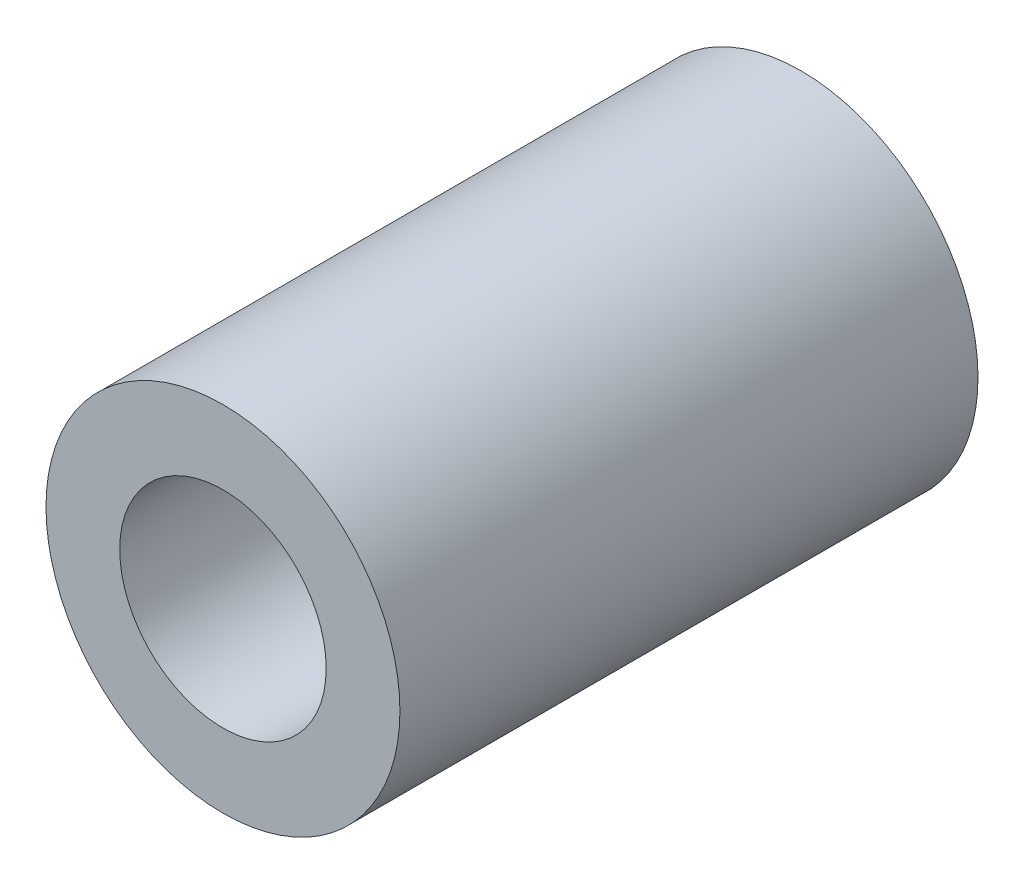
ISO-10303-21;
HEADER;
FILE_DESCRIPTION(('STEP AP214'),'2;1');
FILE_NAME('part.step','',(''),(''),'','','');
FILE_SCHEMA(('AUTOMOTIVE_DESIGN { 1 0 10303 214 1 1 1 1 }'));
ENDSEC;
DATA;
#1=APPLICATION_CONTEXT('core data for automotive mechanical design processes');
#2=APPLICATION_PROTOCOL_DEFINITION('international standard','automotive_design',2000,#1);
#3=PRODUCT_CONTEXT('',#1,'mechanical');
#4=PRODUCT('Part','Part','',(#3));
#5=PRODUCT_RELATED_PRODUCT_CATEGORY('part','',(#4));
#6=PRODUCT_DEFINITION_FORMATION('','',#4);
#7=PRODUCT_DEFINITION_CONTEXT('part definition',#1,'design');
#8=PRODUCT_DEFINITION('design','',#6,#7);
#9=PRODUCT_DEFINITION_SHAPE('','',#8);
#10=(LENGTH_UNIT() NAMED_UNIT(*) SI_UNIT(.MILLI.,.METRE.));
#11=(NAMED_UNIT(*) PLANE_ANGLE_UNIT() SI_UNIT($,.RADIAN.));
#12=(NAMED_UNIT(*) SI_UNIT($,.STERADIAN.) SOLID_ANGLE_UNIT());
#13=UNCERTAINTY_MEASURE_WITH_UNIT(LENGTH_MEASURE(1.E-05),#10,'distance_accuracy_value','');
#14=(GEOMETRIC_REPRESENTATION_CONTEXT(3) GLOBAL_UNCERTAINTY_ASSIGNED_CONTEXT((#13)) GLOBAL_UNIT_ASSIGNED_CONTEXT((#10,
#11,#12)) REPRESENTATION_CONTEXT('',''));
#15=CARTESIAN_POINT('',(0.,0.,0.));
#16=DIRECTION('',(0.,0.,1.));
#17=DIRECTION('',(1.,0.,0.));
#18=AXIS2_PLACEMENT_3D('',#15,#16,#17);
#19=CARTESIAN_POINT('',(-39.0983606557377,16.4754098360656,98.));
#20=DIRECTION('',(0.,0.,-1.));
#21=DIRECTION('',(-1.,0.,0.));
#22=AXIS2_PLACEMENT_3D('',#19,#20,#21);
#23=CYLINDRICAL_SURFACE('',#22,30.);
#24=CARTESIAN_POINT('',(-39.0983606557377,16.4754098360656,98.));
#25=DIRECTION('',(0.,0.,1.));
#26=DIRECTION('',(1.,0.,0.));
#27=AXIS2_PLACEMENT_3D('',#24,#25,#26);
#28=CIRCLE('',#27,30.);
#29=CARTESIAN_POINT('',(-9.09836065573773,16.4754098360656,98.));
#30=VERTEX_POINT('',#29);
#31=EDGE_CURVE('E10',#30,#30,#28,.T.);
#32=ORIENTED_EDGE('',*,*,#31,.F.);
#33=EDGE_LOOP('',(#32));
#34=FACE_BOUND('',#33,.T.);
#35=CARTESIAN_POINT('',(-39.0983606557377,16.4754098360656,0.));
#36=DIRECTION('',(0.,0.,1.));
#37=DIRECTION('',(1.,0.,0.));
#38=AXIS2_PLACEMENT_3D('',#35,#36,#37);
#39=CIRCLE('',#38,30.);
#40=CARTESIAN_POINT('',(-9.09836065573773,16.4754098360656,0.));
#41=VERTEX_POINT('',#40);
#42=EDGE_CURVE('E44',#41,#41,#39,.T.);
#43=ORIENTED_EDGE('',*,*,#42,.T.);
#44=EDGE_LOOP('',(#43));
#45=FACE_BOUND('',#44,.T.);
#46=ADVANCED_FACE('F41',(#34,#45),#23,.T.);
#47=CARTESIAN_POINT('',(-39.0983606557377,16.4754098360656,98.));
#48=DIRECTION('',(0.,0.,1.));
#49=DIRECTION('',(1.,0.,0.));
#50=AXIS2_PLACEMENT_3D('',#47,#48,#49);
#51=PLANE('',#50);
#52=CARTESIAN_POINT('',(-39.0983606557377,16.4754098360656,98.));
#53=DIRECTION('',(0.,0.,1.));
#54=DIRECTION('',(1.,0.,0.));
#55=AXIS2_PLACEMENT_3D('',#52,#53,#54);
#56=CIRCLE('',#55,17.5);
#57=CARTESIAN_POINT('',(-21.5983606557377,16.4754098360656,98.));
#58=VERTEX_POINT('',#57);
#59=EDGE_CURVE('E55',#58,#58,#56,.T.);
#60=ORIENTED_EDGE('',*,*,#59,.F.);
#61=EDGE_LOOP('',(#60));
#62=FACE_BOUND('',#61,.T.);
#63=ORIENTED_EDGE('',*,*,#31,.T.);
#64=EDGE_LOOP('',(#63));
#65=FACE_BOUND('',#64,.T.);
#66=ADVANCED_FACE('F84',(#62,#65),#51,.T.);
#67=CARTESIAN_POINT('',(-39.0983606557377,16.4754098360656,0.));
#68=DIRECTION('',(0.,0.,1.));
#69=DIRECTION('',(1.,0.,0.));
#70=AXIS2_PLACEMENT_3D('',#67,#68,#69);
#71=PLANE('',#70);
#72=CARTESIAN_POINT('',(-39.0983606557377,16.4754098360656,0.));
#73=DIRECTION('',(0.,0.,-1.));
#74=DIRECTION('',(-1.,0.,0.));
#75=AXIS2_PLACEMENT_3D('',#72,#73,#74);
#76=CIRCLE('',#75,12.5);
#77=CARTESIAN_POINT('',(-51.5983606557377,16.4754098360656,0.));
#78=VERTEX_POINT('',#77);
#79=EDGE_CURVE('E63',#78,#78,#76,.T.);
#80=ORIENTED_EDGE('',*,*,#79,.F.);
#81=EDGE_LOOP('',(#80));
#82=FACE_BOUND('',#81,.T.);
#83=ORIENTED_EDGE('',*,*,#42,.F.);
#84=EDGE_LOOP('',(#83));
#85=FACE_BOUND('',#84,.T.);
#86=ADVANCED_FACE('F80',(#82,#85),#71,.F.);
#87=CARTESIAN_POINT('',(-39.0983606557377,16.4754098360656,73.));
#88=DIRECTION('',(0.,0.,1.));
#89=DIRECTION('',(1.,0.,0.));
#90=AXIS2_PLACEMENT_3D('',#87,#88,#89);
#91=CYLINDRICAL_SURFACE('',#90,17.5);
#92=CARTESIAN_POINT('',(-39.0983606557377,16.4754098360656,73.));
#93=DIRECTION('',(0.,0.,1.));
#94=DIRECTION('',(1.,0.,0.));
#95=AXIS2_PLACEMENT_3D('',#92,#93,#94);
#96=CIRCLE('',#95,17.5);
#97=CARTESIAN_POINT('',(-21.5983606557377,16.4754098360656,73.));
#98=VERTEX_POINT('',#97);
#99=EDGE_CURVE('E53',#98,#98,#96,.T.);
#100=ORIENTED_EDGE('',*,*,#99,.F.);
#101=EDGE_LOOP('',(#100));
#102=FACE_BOUND('',#101,.T.);
#103=ORIENTED_EDGE('',*,*,#59,.T.);
#104=EDGE_LOOP('',(#103));
#105=FACE_BOUND('',#104,.T.);
#106=ADVANCED_FACE('F83',(#102,#105),#91,.F.);
#107=CARTESIAN_POINT('',(-39.0983606557377,16.4754098360656,73.));
#108=DIRECTION('',(0.,0.,1.));
#109=DIRECTION('',(1.,0.,0.));
#110=AXIS2_PLACEMENT_3D('',#107,#108,#109);
#111=PLANE('',#110);
#112=ORIENTED_EDGE('',*,*,#99,.T.);
#113=EDGE_LOOP('',(#112));
#114=FACE_BOUND('',#113,.T.);
#115=ADVANCED_FACE('F76',(#114),#111,.T.);
#116=CARTESIAN_POINT('',(-39.0983606557377,16.4754098360656,25.));
#117=DIRECTION('',(0.,0.,-1.));
#118=DIRECTION('',(-1.,0.,0.));
#119=AXIS2_PLACEMENT_3D('',#116,#117,#118);
#120=CYLINDRICAL_SURFACE('',#119,12.5);
#121=CARTESIAN_POINT('',(-39.0983606557377,16.4754098360656,25.));
#122=DIRECTION('',(0.,0.,-1.));
#123=DIRECTION('',(-1.,0.,0.));
#124=AXIS2_PLACEMENT_3D('',#121,#122,#123);
#125=CIRCLE('',#124,12.5);
#126=CARTESIAN_POINT('',(-51.5983606557377,16.4754098360656,25.));
#127=VERTEX_POINT('',#126);
#128=EDGE_CURVE('E59',#127,#127,#125,.T.);
#129=ORIENTED_EDGE('',*,*,#128,.F.);
#130=EDGE_LOOP('',(#129));
#131=FACE_BOUND('',#130,.T.);
#132=ORIENTED_EDGE('',*,*,#79,.T.);
#133=EDGE_LOOP('',(#132));
#134=FACE_BOUND('',#133,.T.);
#135=ADVANCED_FACE('F73',(#131,#134),#120,.F.);
#136=CARTESIAN_POINT('',(-39.0983606557377,16.4754098360656,25.));
#137=DIRECTION('',(0.,0.,-1.));
#138=DIRECTION('',(-1.,0.,0.));
#139=AXIS2_PLACEMENT_3D('',#136,#137,#138);
#140=PLANE('',#139);
#141=ORIENTED_EDGE('',*,*,#128,.T.);
#142=EDGE_LOOP('',(#141));
#143=FACE_BOUND('',#142,.T.);
#144=ADVANCED_FACE('F71',(#143),#140,.T.);
#145=CLOSED_SHELL('',(#46,#66,#86,#106,#115,#135,#144));
#146=MANIFOLD_SOLID_BREP('B2',#145);
#147=ADVANCED_BREP_SHAPE_REPRESENTATION('',(#18,#146),#14);
#148=SHAPE_DEFINITION_REPRESENTATION(#9,#147);
ENDSEC;
END-ISO-10303-21;
